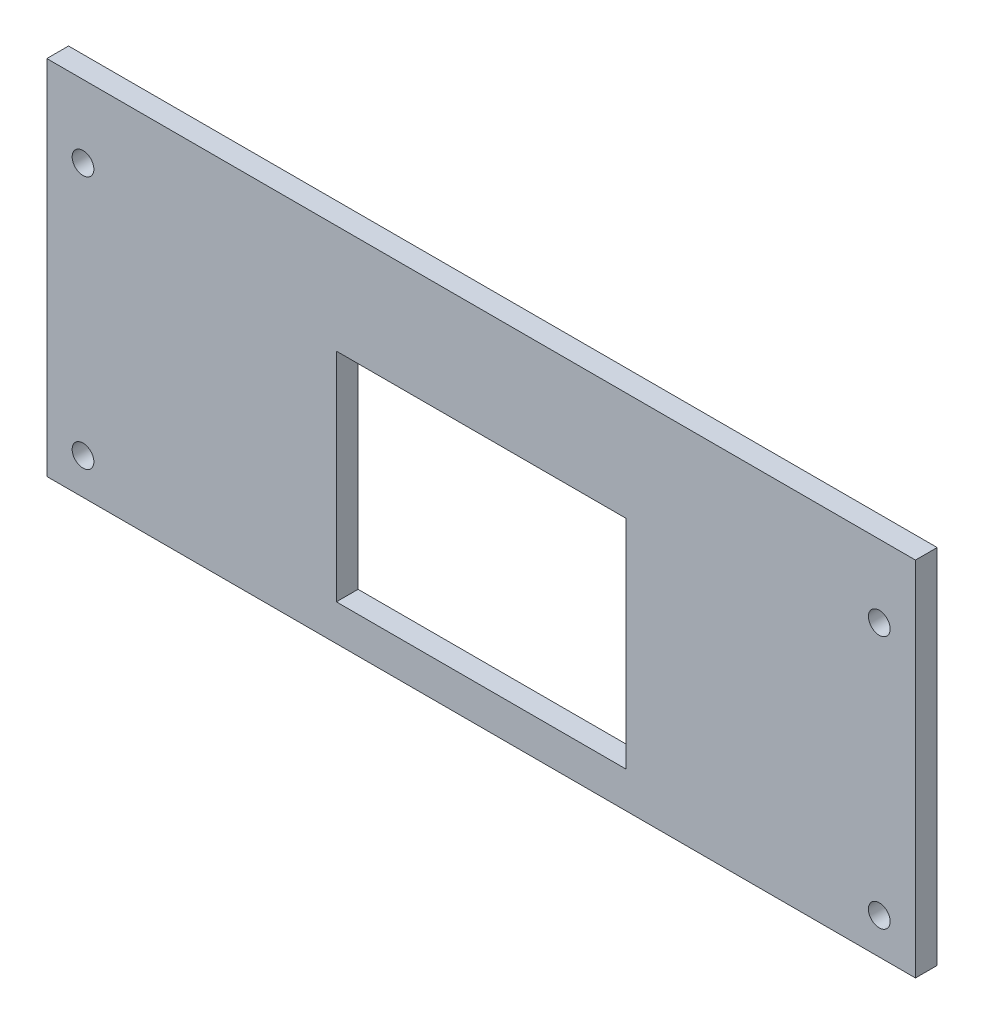
ISO-10303-21;
HEADER;
FILE_DESCRIPTION(('STEP AP214'),'2;1');
FILE_NAME('part.step','',(''),(''),'','','');
FILE_SCHEMA(('AUTOMOTIVE_DESIGN { 1 0 10303 214 1 1 1 1 }'));
ENDSEC;
DATA;
#1=APPLICATION_CONTEXT('core data for automotive mechanical design processes');
#2=APPLICATION_PROTOCOL_DEFINITION('international standard','automotive_design',2000,#1);
#3=PRODUCT_CONTEXT('',#1,'mechanical');
#4=PRODUCT('Part','Part','',(#3));
#5=PRODUCT_RELATED_PRODUCT_CATEGORY('part','',(#4));
#6=PRODUCT_DEFINITION_FORMATION('','',#4);
#7=PRODUCT_DEFINITION_CONTEXT('part definition',#1,'design');
#8=PRODUCT_DEFINITION('design','',#6,#7);
#9=PRODUCT_DEFINITION_SHAPE('','',#8);
#10=(LENGTH_UNIT() NAMED_UNIT(*) SI_UNIT(.MILLI.,.METRE.));
#11=(NAMED_UNIT(*) PLANE_ANGLE_UNIT() SI_UNIT($,.RADIAN.));
#12=(NAMED_UNIT(*) SI_UNIT($,.STERADIAN.) SOLID_ANGLE_UNIT());
#13=UNCERTAINTY_MEASURE_WITH_UNIT(LENGTH_MEASURE(1.E-05),#10,'distance_accuracy_value','');
#14=(GEOMETRIC_REPRESENTATION_CONTEXT(3) GLOBAL_UNCERTAINTY_ASSIGNED_CONTEXT((#13)) GLOBAL_UNIT_ASSIGNED_CONTEXT((#10,
#11,#12)) REPRESENTATION_CONTEXT('',''));
#15=CARTESIAN_POINT('',(0.,0.,0.));
#16=DIRECTION('',(0.,0.,1.));
#17=DIRECTION('',(1.,0.,0.));
#18=AXIS2_PLACEMENT_3D('',#15,#16,#17);
#19=CARTESIAN_POINT('',(0.,0.,3.));
#20=DIRECTION('',(0.,0.,1.));
#21=DIRECTION('',(1.,0.,0.));
#22=AXIS2_PLACEMENT_3D('',#19,#20,#21);
#23=PLANE('',#22);
#24=CARTESIAN_POINT('',(55.,-20.,3.));
#25=DIRECTION('',(0.,0.,1.));
#26=DIRECTION('',(-1.,0.,0.));
#27=AXIS2_PLACEMENT_3D('',#24,#25,#26);
#28=CIRCLE('',#27,1.5);
#29=CARTESIAN_POINT('',(53.5,-20.,3.));
#30=VERTEX_POINT('',#29);
#31=EDGE_CURVE('E142',#30,#30,#28,.T.);
#32=ORIENTED_EDGE('',*,*,#31,.F.);
#33=EDGE_LOOP('',(#32));
#34=FACE_BOUND('',#33,.T.);
#35=CARTESIAN_POINT('',(-55.,15.,3.));
#36=DIRECTION('',(0.,0.,1.));
#37=DIRECTION('',(1.,0.,0.));
#38=AXIS2_PLACEMENT_3D('',#35,#36,#37);
#39=CIRCLE('',#38,1.5);
#40=CARTESIAN_POINT('',(-53.5,15.,3.));
#41=VERTEX_POINT('',#40);
#42=EDGE_CURVE('E154',#41,#41,#39,.T.);
#43=ORIENTED_EDGE('',*,*,#42,.F.);
#44=EDGE_LOOP('',(#43));
#45=FACE_BOUND('',#44,.T.);
#46=DIRECTION('',(0.,-1.,0.));
#47=VECTOR('',#46,1.);
#48=CARTESIAN_POINT('',(-60.,-25.,3.));
#49=LINE('',#48,#47);
#50=CARTESIAN_POINT('',(-60.,25.,3.));
#51=VERTEX_POINT('',#50);
#52=CARTESIAN_POINT('',(-60.,-25.,3.));
#53=VERTEX_POINT('',#52);
#54=EDGE_CURVE('E160',#51,#53,#49,.T.);
#55=ORIENTED_EDGE('',*,*,#54,.T.);
#56=DIRECTION('',(1.,0.,0.));
#57=VECTOR('',#56,1.);
#58=CARTESIAN_POINT('',(60.,-25.,3.));
#59=LINE('',#58,#57);
#60=CARTESIAN_POINT('',(60.,-25.,3.));
#61=VERTEX_POINT('',#60);
#62=EDGE_CURVE('E163',#53,#61,#59,.T.);
#63=ORIENTED_EDGE('',*,*,#62,.T.);
#64=DIRECTION('',(0.,1.,0.));
#65=VECTOR('',#64,1.);
#66=CARTESIAN_POINT('',(60.,-25.,3.));
#67=LINE('',#66,#65);
#68=CARTESIAN_POINT('',(60.,25.,3.));
#69=VERTEX_POINT('',#68);
#70=EDGE_CURVE('E166',#61,#69,#67,.T.);
#71=ORIENTED_EDGE('',*,*,#70,.T.);
#72=DIRECTION('',(-1.,0.,0.));
#73=VECTOR('',#72,1.);
#74=CARTESIAN_POINT('',(60.,25.,3.));
#75=LINE('',#74,#73);
#76=EDGE_CURVE('E168',#69,#51,#75,.T.);
#77=ORIENTED_EDGE('',*,*,#76,.T.);
#78=EDGE_LOOP('',(#55,#63,#71,#77));
#79=FACE_BOUND('',#78,.T.);
#80=CARTESIAN_POINT('',(-55.,-20.,3.));
#81=DIRECTION('',(0.,0.,1.));
#82=DIRECTION('',(1.,0.,0.));
#83=AXIS2_PLACEMENT_3D('',#80,#81,#82);
#84=CIRCLE('',#83,1.5);
#85=CARTESIAN_POINT('',(-53.5,-20.,3.));
#86=VERTEX_POINT('',#85);
#87=EDGE_CURVE('E148',#86,#86,#84,.T.);
#88=ORIENTED_EDGE('',*,*,#87,.F.);
#89=EDGE_LOOP('',(#88));
#90=FACE_BOUND('',#89,.T.);
#91=CARTESIAN_POINT('',(55.,15.,3.));
#92=DIRECTION('',(0.,0.,1.));
#93=DIRECTION('',(-1.,0.,0.));
#94=AXIS2_PLACEMENT_3D('',#91,#92,#93);
#95=CIRCLE('',#94,1.5);
#96=CARTESIAN_POINT('',(53.5,15.,3.));
#97=VERTEX_POINT('',#96);
#98=EDGE_CURVE('E136',#97,#97,#95,.T.);
#99=ORIENTED_EDGE('',*,*,#98,.F.);
#100=EDGE_LOOP('',(#99));
#101=FACE_BOUND('',#100,.T.);
#102=DIRECTION('',(1.,0.,0.));
#103=VECTOR('',#102,1.);
#104=CARTESIAN_POINT('',(20.,-20.,3.));
#105=LINE('',#104,#103);
#106=CARTESIAN_POINT('',(-20.,-20.,3.));
#107=VERTEX_POINT('',#106);
#108=CARTESIAN_POINT('',(20.,-20.,3.));
#109=VERTEX_POINT('',#108);
#110=EDGE_CURVE('E108',#107,#109,#105,.T.);
#111=ORIENTED_EDGE('',*,*,#110,.F.);
#112=DIRECTION('',(0.,-1.,0.));
#113=VECTOR('',#112,1.);
#114=CARTESIAN_POINT('',(-20.,-20.,3.));
#115=LINE('',#114,#113);
#116=CARTESIAN_POINT('',(-20.,10.,3.));
#117=VERTEX_POINT('',#116);
#118=EDGE_CURVE('E100',#117,#107,#115,.T.);
#119=ORIENTED_EDGE('',*,*,#118,.F.);
#120=DIRECTION('',(-1.,0.,0.));
#121=VECTOR('',#120,1.);
#122=CARTESIAN_POINT('',(20.,10.,3.));
#123=LINE('',#122,#121);
#124=CARTESIAN_POINT('',(20.,10.,3.));
#125=VERTEX_POINT('',#124);
#126=EDGE_CURVE('E122',#125,#117,#123,.T.);
#127=ORIENTED_EDGE('',*,*,#126,.F.);
#128=DIRECTION('',(0.,1.,0.));
#129=VECTOR('',#128,1.);
#130=CARTESIAN_POINT('',(20.,-20.,3.));
#131=LINE('',#130,#129);
#132=EDGE_CURVE('E120',#109,#125,#131,.T.);
#133=ORIENTED_EDGE('',*,*,#132,.F.);
#134=EDGE_LOOP('',(#111,#119,#127,#133));
#135=FACE_BOUND('',#134,.T.);
#136=ADVANCED_FACE('F35',(#34,#45,#79,#90,#101,#135),#23,.T.);
#137=CARTESIAN_POINT('',(0.,0.,0.));
#138=DIRECTION('',(0.,0.,1.));
#139=DIRECTION('',(1.,0.,0.));
#140=AXIS2_PLACEMENT_3D('',#137,#138,#139);
#141=PLANE('',#140);
#142=CARTESIAN_POINT('',(55.,15.,0.));
#143=DIRECTION('',(0.,0.,1.));
#144=DIRECTION('',(-1.,0.,0.));
#145=AXIS2_PLACEMENT_3D('',#142,#143,#144);
#146=CIRCLE('',#145,1.5);
#147=CARTESIAN_POINT('',(53.5,15.,0.));
#148=VERTEX_POINT('',#147);
#149=EDGE_CURVE('E116',#148,#148,#146,.T.);
#150=ORIENTED_EDGE('',*,*,#149,.T.);
#151=EDGE_LOOP('',(#150));
#152=FACE_BOUND('',#151,.T.);
#153=CARTESIAN_POINT('',(55.,-20.,0.));
#154=DIRECTION('',(0.,0.,1.));
#155=DIRECTION('',(-1.,0.,0.));
#156=AXIS2_PLACEMENT_3D('',#153,#154,#155);
#157=CIRCLE('',#156,1.5);
#158=CARTESIAN_POINT('',(53.5,-20.,0.));
#159=VERTEX_POINT('',#158);
#160=EDGE_CURVE('E139',#159,#159,#157,.T.);
#161=ORIENTED_EDGE('',*,*,#160,.T.);
#162=EDGE_LOOP('',(#161));
#163=FACE_BOUND('',#162,.T.);
#164=CARTESIAN_POINT('',(-55.,-20.,0.));
#165=DIRECTION('',(0.,0.,1.));
#166=DIRECTION('',(1.,0.,0.));
#167=AXIS2_PLACEMENT_3D('',#164,#165,#166);
#168=CIRCLE('',#167,1.5);
#169=CARTESIAN_POINT('',(-53.5,-20.,0.));
#170=VERTEX_POINT('',#169);
#171=EDGE_CURVE('E145',#170,#170,#168,.T.);
#172=ORIENTED_EDGE('',*,*,#171,.T.);
#173=EDGE_LOOP('',(#172));
#174=FACE_BOUND('',#173,.T.);
#175=CARTESIAN_POINT('',(-55.,15.,0.));
#176=DIRECTION('',(0.,0.,1.));
#177=DIRECTION('',(1.,0.,0.));
#178=AXIS2_PLACEMENT_3D('',#175,#176,#177);
#179=CIRCLE('',#178,1.5);
#180=CARTESIAN_POINT('',(-53.5,15.,0.));
#181=VERTEX_POINT('',#180);
#182=EDGE_CURVE('E151',#181,#181,#179,.T.);
#183=ORIENTED_EDGE('',*,*,#182,.T.);
#184=EDGE_LOOP('',(#183));
#185=FACE_BOUND('',#184,.T.);
#186=DIRECTION('',(0.,-1.,0.));
#187=VECTOR('',#186,1.);
#188=CARTESIAN_POINT('',(-60.,-25.,0.));
#189=LINE('',#188,#187);
#190=CARTESIAN_POINT('',(-60.,25.,0.));
#191=VERTEX_POINT('',#190);
#192=CARTESIAN_POINT('',(-60.,-25.,0.));
#193=VERTEX_POINT('',#192);
#194=EDGE_CURVE('E157',#191,#193,#189,.T.);
#195=ORIENTED_EDGE('',*,*,#194,.F.);
#196=DIRECTION('',(-1.,0.,0.));
#197=VECTOR('',#196,1.);
#198=CARTESIAN_POINT('',(60.,25.,0.));
#199=LINE('',#198,#197);
#200=CARTESIAN_POINT('',(60.,25.,0.));
#201=VERTEX_POINT('',#200);
#202=EDGE_CURVE('E164',#201,#191,#199,.T.);
#203=ORIENTED_EDGE('',*,*,#202,.F.);
#204=DIRECTION('',(0.,1.,0.));
#205=VECTOR('',#204,1.);
#206=CARTESIAN_POINT('',(60.,-25.,0.));
#207=LINE('',#206,#205);
#208=CARTESIAN_POINT('',(60.,-25.,0.));
#209=VERTEX_POINT('',#208);
#210=EDGE_CURVE('E175',#209,#201,#207,.T.);
#211=ORIENTED_EDGE('',*,*,#210,.F.);
#212=DIRECTION('',(1.,0.,0.));
#213=VECTOR('',#212,1.);
#214=CARTESIAN_POINT('',(60.,-25.,0.));
#215=LINE('',#214,#213);
#216=EDGE_CURVE('E173',#193,#209,#215,.T.);
#217=ORIENTED_EDGE('',*,*,#216,.F.);
#218=EDGE_LOOP('',(#195,#203,#211,#217));
#219=FACE_BOUND('',#218,.T.);
#220=DIRECTION('',(0.,-1.,0.));
#221=VECTOR('',#220,1.);
#222=CARTESIAN_POINT('',(-20.,-20.,0.));
#223=LINE('',#222,#221);
#224=CARTESIAN_POINT('',(-20.,10.,0.));
#225=VERTEX_POINT('',#224);
#226=CARTESIAN_POINT('',(-20.,-20.,0.));
#227=VERTEX_POINT('',#226);
#228=EDGE_CURVE('E58',#225,#227,#223,.T.);
#229=ORIENTED_EDGE('',*,*,#228,.T.);
#230=DIRECTION('',(1.,0.,0.));
#231=VECTOR('',#230,1.);
#232=CARTESIAN_POINT('',(20.,-20.,0.));
#233=LINE('',#232,#231);
#234=CARTESIAN_POINT('',(20.,-20.,0.));
#235=VERTEX_POINT('',#234);
#236=EDGE_CURVE('E115',#227,#235,#233,.T.);
#237=ORIENTED_EDGE('',*,*,#236,.T.);
#238=DIRECTION('',(0.,1.,0.));
#239=VECTOR('',#238,1.);
#240=CARTESIAN_POINT('',(20.,-20.,0.));
#241=LINE('',#240,#239);
#242=CARTESIAN_POINT('',(20.,10.,0.));
#243=VERTEX_POINT('',#242);
#244=EDGE_CURVE('E128',#235,#243,#241,.T.);
#245=ORIENTED_EDGE('',*,*,#244,.T.);
#246=DIRECTION('',(-1.,0.,0.));
#247=VECTOR('',#246,1.);
#248=CARTESIAN_POINT('',(20.,10.,0.));
#249=LINE('',#248,#247);
#250=EDGE_CURVE('E109',#243,#225,#249,.T.);
#251=ORIENTED_EDGE('',*,*,#250,.T.);
#252=EDGE_LOOP('',(#229,#237,#245,#251));
#253=FACE_BOUND('',#252,.T.);
#254=ADVANCED_FACE('F193',(#152,#163,#174,#185,#219,#253),#141,.F.);
#255=CARTESIAN_POINT('',(-60.,-25.,3.));
#256=DIRECTION('',(1.,0.,0.));
#257=DIRECTION('',(0.,0.,-1.));
#258=AXIS2_PLACEMENT_3D('',#255,#256,#257);
#259=PLANE('',#258);
#260=ORIENTED_EDGE('',*,*,#194,.T.);
#261=DIRECTION('',(0.,0.,-1.));
#262=VECTOR('',#261,1.);
#263=CARTESIAN_POINT('',(-60.,-25.,3.));
#264=LINE('',#263,#262);
#265=EDGE_CURVE('E11',#53,#193,#264,.T.);
#266=ORIENTED_EDGE('',*,*,#265,.F.);
#267=ORIENTED_EDGE('',*,*,#54,.F.);
#268=DIRECTION('',(0.,0.,-1.));
#269=VECTOR('',#268,1.);
#270=CARTESIAN_POINT('',(-60.,25.,3.));
#271=LINE('',#270,#269);
#272=EDGE_CURVE('E170',#51,#191,#271,.T.);
#273=ORIENTED_EDGE('',*,*,#272,.T.);
#274=EDGE_LOOP('',(#260,#266,#267,#273));
#275=FACE_BOUND('',#274,.T.);
#276=ADVANCED_FACE('F37',(#275),#259,.F.);
#277=CARTESIAN_POINT('',(60.,-25.,3.));
#278=DIRECTION('',(0.,1.,0.));
#279=DIRECTION('',(-1.,0.,0.));
#280=AXIS2_PLACEMENT_3D('',#277,#278,#279);
#281=PLANE('',#280);
#282=ORIENTED_EDGE('',*,*,#216,.T.);
#283=DIRECTION('',(0.,0.,-1.));
#284=VECTOR('',#283,1.);
#285=CARTESIAN_POINT('',(60.,-25.,3.));
#286=LINE('',#285,#284);
#287=EDGE_CURVE('E43',#61,#209,#286,.T.);
#288=ORIENTED_EDGE('',*,*,#287,.F.);
#289=ORIENTED_EDGE('',*,*,#62,.F.);
#290=ORIENTED_EDGE('',*,*,#265,.T.);
#291=EDGE_LOOP('',(#282,#288,#289,#290));
#292=FACE_BOUND('',#291,.T.);
#293=ADVANCED_FACE('F204',(#292),#281,.F.);
#294=CARTESIAN_POINT('',(60.,-25.,3.));
#295=DIRECTION('',(-1.,0.,0.));
#296=DIRECTION('',(0.,0.,1.));
#297=AXIS2_PLACEMENT_3D('',#294,#295,#296);
#298=PLANE('',#297);
#299=ORIENTED_EDGE('',*,*,#210,.T.);
#300=DIRECTION('',(0.,0.,-1.));
#301=VECTOR('',#300,1.);
#302=CARTESIAN_POINT('',(60.,25.,3.));
#303=LINE('',#302,#301);
#304=EDGE_CURVE('E180',#69,#201,#303,.T.);
#305=ORIENTED_EDGE('',*,*,#304,.F.);
#306=ORIENTED_EDGE('',*,*,#70,.F.);
#307=ORIENTED_EDGE('',*,*,#287,.T.);
#308=EDGE_LOOP('',(#299,#305,#306,#307));
#309=FACE_BOUND('',#308,.T.);
#310=ADVANCED_FACE('F187',(#309),#298,.F.);
#311=CARTESIAN_POINT('',(60.,25.,3.));
#312=DIRECTION('',(0.,-1.,0.));
#313=DIRECTION('',(1.,0.,0.));
#314=AXIS2_PLACEMENT_3D('',#311,#312,#313);
#315=PLANE('',#314);
#316=ORIENTED_EDGE('',*,*,#202,.T.);
#317=ORIENTED_EDGE('',*,*,#272,.F.);
#318=ORIENTED_EDGE('',*,*,#76,.F.);
#319=ORIENTED_EDGE('',*,*,#304,.T.);
#320=EDGE_LOOP('',(#316,#317,#318,#319));
#321=FACE_BOUND('',#320,.T.);
#322=ADVANCED_FACE('F197',(#321),#315,.F.);
#323=CARTESIAN_POINT('',(-55.,15.,3.));
#324=DIRECTION('',(0.,0.,-1.));
#325=DIRECTION('',(-1.,0.,0.));
#326=AXIS2_PLACEMENT_3D('',#323,#324,#325);
#327=CYLINDRICAL_SURFACE('',#326,1.5);
#328=ORIENTED_EDGE('',*,*,#42,.T.);
#329=EDGE_LOOP('',(#328));
#330=FACE_BOUND('',#329,.T.);
#331=ORIENTED_EDGE('',*,*,#182,.F.);
#332=EDGE_LOOP('',(#331));
#333=FACE_BOUND('',#332,.T.);
#334=ADVANCED_FACE('F222',(#330,#333),#327,.F.);
#335=CARTESIAN_POINT('',(-55.,-20.,3.));
#336=DIRECTION('',(0.,0.,-1.));
#337=DIRECTION('',(-1.,0.,0.));
#338=AXIS2_PLACEMENT_3D('',#335,#336,#337);
#339=CYLINDRICAL_SURFACE('',#338,1.5);
#340=ORIENTED_EDGE('',*,*,#87,.T.);
#341=EDGE_LOOP('',(#340));
#342=FACE_BOUND('',#341,.T.);
#343=ORIENTED_EDGE('',*,*,#171,.F.);
#344=EDGE_LOOP('',(#343));
#345=FACE_BOUND('',#344,.T.);
#346=ADVANCED_FACE('F229',(#342,#345),#339,.F.);
#347=CARTESIAN_POINT('',(55.,-20.,3.));
#348=DIRECTION('',(0.,0.,-1.));
#349=DIRECTION('',(-1.,0.,0.));
#350=AXIS2_PLACEMENT_3D('',#347,#348,#349);
#351=CYLINDRICAL_SURFACE('',#350,1.5);
#352=ORIENTED_EDGE('',*,*,#31,.T.);
#353=EDGE_LOOP('',(#352));
#354=FACE_BOUND('',#353,.T.);
#355=ORIENTED_EDGE('',*,*,#160,.F.);
#356=EDGE_LOOP('',(#355));
#357=FACE_BOUND('',#356,.T.);
#358=ADVANCED_FACE('F234',(#354,#357),#351,.F.);
#359=CARTESIAN_POINT('',(55.,15.,3.));
#360=DIRECTION('',(0.,0.,-1.));
#361=DIRECTION('',(-1.,0.,0.));
#362=AXIS2_PLACEMENT_3D('',#359,#360,#361);
#363=CYLINDRICAL_SURFACE('',#362,1.5);
#364=ORIENTED_EDGE('',*,*,#98,.T.);
#365=EDGE_LOOP('',(#364));
#366=FACE_BOUND('',#365,.T.);
#367=ORIENTED_EDGE('',*,*,#149,.F.);
#368=EDGE_LOOP('',(#367));
#369=FACE_BOUND('',#368,.T.);
#370=ADVANCED_FACE('F243',(#366,#369),#363,.F.);
#371=CARTESIAN_POINT('',(-20.,-20.,3.));
#372=DIRECTION('',(1.,0.,0.));
#373=DIRECTION('',(0.,1.,0.));
#374=AXIS2_PLACEMENT_3D('',#371,#372,#373);
#375=PLANE('',#374);
#376=ORIENTED_EDGE('',*,*,#228,.F.);
#377=DIRECTION('',(0.,0.,-1.));
#378=VECTOR('',#377,1.);
#379=CARTESIAN_POINT('',(-20.,10.,3.));
#380=LINE('',#379,#378);
#381=EDGE_CURVE('E104',#117,#225,#380,.T.);
#382=ORIENTED_EDGE('',*,*,#381,.F.);
#383=ORIENTED_EDGE('',*,*,#118,.T.);
#384=DIRECTION('',(0.,0.,-1.));
#385=VECTOR('',#384,1.);
#386=CARTESIAN_POINT('',(-20.,-20.,3.));
#387=LINE('',#386,#385);
#388=EDGE_CURVE('E103',#107,#227,#387,.T.);
#389=ORIENTED_EDGE('',*,*,#388,.T.);
#390=EDGE_LOOP('',(#376,#382,#383,#389));
#391=FACE_BOUND('',#390,.T.);
#392=ADVANCED_FACE('F102',(#391),#375,.T.);
#393=CARTESIAN_POINT('',(20.,-20.,3.));
#394=DIRECTION('',(0.,1.,0.));
#395=DIRECTION('',(-1.,0.,0.));
#396=AXIS2_PLACEMENT_3D('',#393,#394,#395);
#397=PLANE('',#396);
#398=ORIENTED_EDGE('',*,*,#236,.F.);
#399=ORIENTED_EDGE('',*,*,#388,.F.);
#400=ORIENTED_EDGE('',*,*,#110,.T.);
#401=DIRECTION('',(0.,0.,-1.));
#402=VECTOR('',#401,1.);
#403=CARTESIAN_POINT('',(20.,-20.,3.));
#404=LINE('',#403,#402);
#405=EDGE_CURVE('E117',#109,#235,#404,.T.);
#406=ORIENTED_EDGE('',*,*,#405,.T.);
#407=EDGE_LOOP('',(#398,#399,#400,#406));
#408=FACE_BOUND('',#407,.T.);
#409=ADVANCED_FACE('F112',(#408),#397,.T.);
#410=CARTESIAN_POINT('',(20.,-20.,3.));
#411=DIRECTION('',(-1.,0.,0.));
#412=DIRECTION('',(0.,0.,1.));
#413=AXIS2_PLACEMENT_3D('',#410,#411,#412);
#414=PLANE('',#413);
#415=ORIENTED_EDGE('',*,*,#244,.F.);
#416=ORIENTED_EDGE('',*,*,#405,.F.);
#417=ORIENTED_EDGE('',*,*,#132,.T.);
#418=DIRECTION('',(0.,0.,-1.));
#419=VECTOR('',#418,1.);
#420=CARTESIAN_POINT('',(20.,10.,3.));
#421=LINE('',#420,#419);
#422=EDGE_CURVE('E50',#125,#243,#421,.T.);
#423=ORIENTED_EDGE('',*,*,#422,.T.);
#424=EDGE_LOOP('',(#415,#416,#417,#423));
#425=FACE_BOUND('',#424,.T.);
#426=ADVANCED_FACE('F255',(#425),#414,.T.);
#427=CARTESIAN_POINT('',(20.,10.,3.));
#428=DIRECTION('',(0.,-1.,0.));
#429=DIRECTION('',(1.,0.,0.));
#430=AXIS2_PLACEMENT_3D('',#427,#428,#429);
#431=PLANE('',#430);
#432=ORIENTED_EDGE('',*,*,#250,.F.);
#433=ORIENTED_EDGE('',*,*,#422,.F.);
#434=ORIENTED_EDGE('',*,*,#126,.T.);
#435=ORIENTED_EDGE('',*,*,#381,.T.);
#436=EDGE_LOOP('',(#432,#433,#434,#435));
#437=FACE_BOUND('',#436,.T.);
#438=ADVANCED_FACE('F258',(#437),#431,.T.);
#439=CLOSED_SHELL('',(#136,#254,#276,#293,#310,#322,#334,#346,#358,#370,#392,#409,#426,#438));
#440=MANIFOLD_SOLID_BREP('B2',#439);
#441=ADVANCED_BREP_SHAPE_REPRESENTATION('',(#18,#440),#14);
#442=SHAPE_DEFINITION_REPRESENTATION(#9,#441);
ENDSEC;
END-ISO-10303-21;
